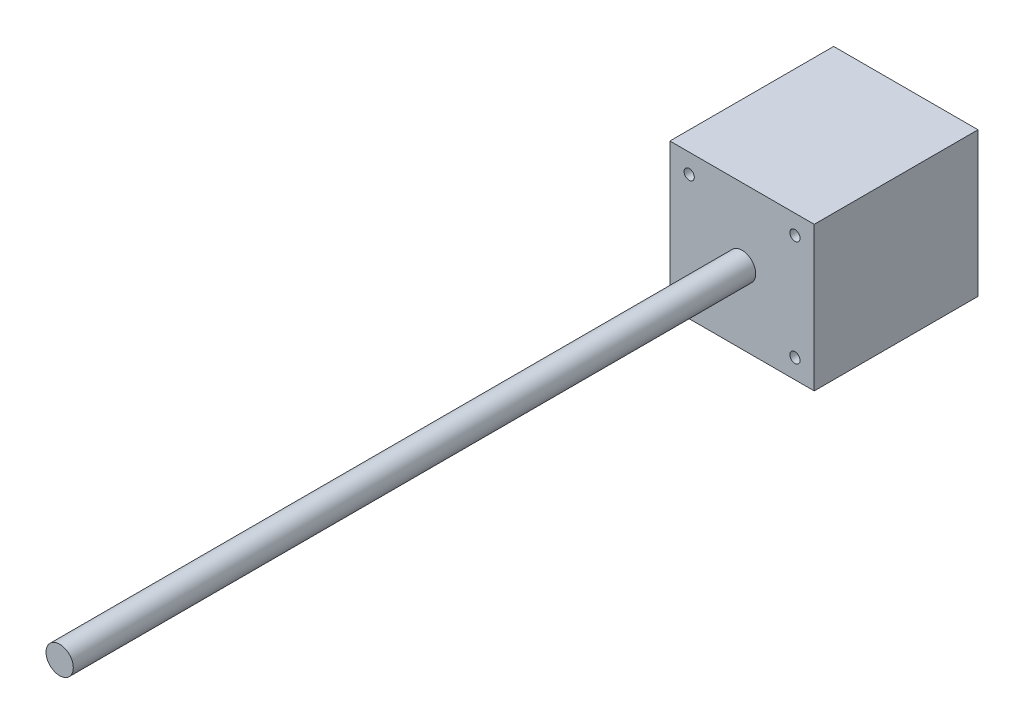
ISO-10303-21;
HEADER;
FILE_DESCRIPTION(('STEP AP214'),'2;1');
FILE_NAME('part.step','',(''),(''),'','','');
FILE_SCHEMA(('AUTOMOTIVE_DESIGN { 1 0 10303 214 1 1 1 1 }'));
ENDSEC;
DATA;
#1=APPLICATION_CONTEXT('core data for automotive mechanical design processes');
#2=APPLICATION_PROTOCOL_DEFINITION('international standard','automotive_design',2000,#1);
#3=PRODUCT_CONTEXT('',#1,'mechanical');
#4=PRODUCT('Part','Part','',(#3));
#5=PRODUCT_RELATED_PRODUCT_CATEGORY('part','',(#4));
#6=PRODUCT_DEFINITION_FORMATION('','',#4);
#7=PRODUCT_DEFINITION_CONTEXT('part definition',#1,'design');
#8=PRODUCT_DEFINITION('design','',#6,#7);
#9=PRODUCT_DEFINITION_SHAPE('','',#8);
#10=(LENGTH_UNIT() NAMED_UNIT(*) SI_UNIT(.MILLI.,.METRE.));
#11=(NAMED_UNIT(*) PLANE_ANGLE_UNIT() SI_UNIT($,.RADIAN.));
#12=(NAMED_UNIT(*) SI_UNIT($,.STERADIAN.) SOLID_ANGLE_UNIT());
#13=UNCERTAINTY_MEASURE_WITH_UNIT(LENGTH_MEASURE(1.E-05),#10,'distance_accuracy_value','');
#14=(GEOMETRIC_REPRESENTATION_CONTEXT(3) GLOBAL_UNCERTAINTY_ASSIGNED_CONTEXT((#13)) GLOBAL_UNIT_ASSIGNED_CONTEXT((#10,
#11,#12)) REPRESENTATION_CONTEXT('',''));
#15=CARTESIAN_POINT('',(0.,0.,0.));
#16=DIRECTION('',(0.,0.,1.));
#17=DIRECTION('',(1.,0.,0.));
#18=AXIS2_PLACEMENT_3D('',#15,#16,#17);
#19=CARTESIAN_POINT('',(0.,0.,48.));
#20=DIRECTION('',(0.,0.,-1.));
#21=DIRECTION('',(-1.,0.,0.));
#22=AXIS2_PLACEMENT_3D('',#19,#20,#21);
#23=PLANE('',#22);
#24=CARTESIAN_POINT('',(0.,0.,48.));
#25=DIRECTION('',(0.,0.,-1.));
#26=DIRECTION('',(-1.,0.,0.));
#27=AXIS2_PLACEMENT_3D('',#24,#25,#26);
#28=CIRCLE('',#27,4.);
#29=CARTESIAN_POINT('',(-4.,0.,48.));
#30=VERTEX_POINT('',#29);
#31=EDGE_CURVE('E11',#30,#30,#28,.F.);
#32=ORIENTED_EDGE('',*,*,#31,.F.);
#33=EDGE_LOOP('',(#32));
#34=FACE_BOUND('',#33,.T.);
#35=DIRECTION('',(0.,1.,0.));
#36=VECTOR('',#35,1.);
#37=CARTESIAN_POINT('',(21.15,-21.15,48.));
#38=LINE('',#37,#36);
#39=CARTESIAN_POINT('',(21.15,-21.15,48.));
#40=VERTEX_POINT('',#39);
#41=CARTESIAN_POINT('',(21.15,21.15,48.));
#42=VERTEX_POINT('',#41);
#43=EDGE_CURVE('E90',#40,#42,#38,.T.);
#44=ORIENTED_EDGE('',*,*,#43,.T.);
#45=DIRECTION('',(-1.,0.,0.));
#46=VECTOR('',#45,1.);
#47=CARTESIAN_POINT('',(-21.15,21.15,48.));
#48=LINE('',#47,#46);
#49=CARTESIAN_POINT('',(-21.15,21.15,48.));
#50=VERTEX_POINT('',#49);
#51=EDGE_CURVE('E85',#42,#50,#48,.T.);
#52=ORIENTED_EDGE('',*,*,#51,.T.);
#53=DIRECTION('',(0.,-1.,0.));
#54=VECTOR('',#53,1.);
#55=CARTESIAN_POINT('',(-21.15,-21.15,48.));
#56=LINE('',#55,#54);
#57=CARTESIAN_POINT('',(-21.15,-21.15,48.));
#58=VERTEX_POINT('',#57);
#59=EDGE_CURVE('E88',#50,#58,#56,.T.);
#60=ORIENTED_EDGE('',*,*,#59,.T.);
#61=DIRECTION('',(1.,0.,0.));
#62=VECTOR('',#61,1.);
#63=CARTESIAN_POINT('',(-21.15,-21.15,48.));
#64=LINE('',#63,#62);
#65=EDGE_CURVE('E54',#58,#40,#64,.T.);
#66=ORIENTED_EDGE('',*,*,#65,.T.);
#67=EDGE_LOOP('',(#44,#52,#60,#66));
#68=FACE_BOUND('',#67,.T.);
#69=CARTESIAN_POINT('',(15.5,15.5,48.));
#70=DIRECTION('',(0.,0.,1.));
#71=DIRECTION('',(1.,0.,0.));
#72=AXIS2_PLACEMENT_3D('',#69,#70,#71);
#73=CIRCLE('',#72,1.5);
#74=CARTESIAN_POINT('',(17.,15.5,48.));
#75=VERTEX_POINT('',#74);
#76=EDGE_CURVE('E107',#75,#75,#73,.T.);
#77=ORIENTED_EDGE('',*,*,#76,.F.);
#78=EDGE_LOOP('',(#77));
#79=FACE_BOUND('',#78,.T.);
#80=CARTESIAN_POINT('',(-15.5,15.5,48.));
#81=DIRECTION('',(0.,0.,1.));
#82=DIRECTION('',(1.,0.,0.));
#83=AXIS2_PLACEMENT_3D('',#80,#81,#82);
#84=CIRCLE('',#83,1.5);
#85=CARTESIAN_POINT('',(-14.,15.5,48.));
#86=VERTEX_POINT('',#85);
#87=EDGE_CURVE('E142',#86,#86,#84,.T.);
#88=ORIENTED_EDGE('',*,*,#87,.F.);
#89=EDGE_LOOP('',(#88));
#90=FACE_BOUND('',#89,.T.);
#91=CARTESIAN_POINT('',(-15.5,-15.5,48.));
#92=DIRECTION('',(0.,0.,1.));
#93=DIRECTION('',(1.,0.,0.));
#94=AXIS2_PLACEMENT_3D('',#91,#92,#93);
#95=CIRCLE('',#94,1.5);
#96=CARTESIAN_POINT('',(-14.,-15.5,48.));
#97=VERTEX_POINT('',#96);
#98=EDGE_CURVE('E137',#97,#97,#95,.T.);
#99=ORIENTED_EDGE('',*,*,#98,.F.);
#100=EDGE_LOOP('',(#99));
#101=FACE_BOUND('',#100,.T.);
#102=CARTESIAN_POINT('',(15.5,-15.5,48.));
#103=DIRECTION('',(0.,0.,1.));
#104=DIRECTION('',(1.,0.,0.));
#105=AXIS2_PLACEMENT_3D('',#102,#103,#104);
#106=CIRCLE('',#105,1.5);
#107=CARTESIAN_POINT('',(17.,-15.5,48.));
#108=VERTEX_POINT('',#107);
#109=EDGE_CURVE('E128',#108,#108,#106,.T.);
#110=ORIENTED_EDGE('',*,*,#109,.F.);
#111=EDGE_LOOP('',(#110));
#112=FACE_BOUND('',#111,.T.);
#113=ADVANCED_FACE('F37',(#34,#68,#79,#90,#101,#112),#23,.F.);
#114=CARTESIAN_POINT('',(0.,0.,0.));
#115=DIRECTION('',(0.,0.,-1.));
#116=DIRECTION('',(-1.,0.,0.));
#117=AXIS2_PLACEMENT_3D('',#114,#115,#116);
#118=PLANE('',#117);
#119=CARTESIAN_POINT('',(-15.5,-15.5,0.));
#120=DIRECTION('',(0.,0.,1.));
#121=DIRECTION('',(1.,0.,0.));
#122=AXIS2_PLACEMENT_3D('',#119,#120,#121);
#123=CIRCLE('',#122,1.5);
#124=CARTESIAN_POINT('',(-14.,-15.5,0.));
#125=VERTEX_POINT('',#124);
#126=EDGE_CURVE('E132',#125,#125,#123,.T.);
#127=ORIENTED_EDGE('',*,*,#126,.T.);
#128=EDGE_LOOP('',(#127));
#129=FACE_BOUND('',#128,.T.);
#130=CARTESIAN_POINT('',(15.5,15.5,0.));
#131=DIRECTION('',(0.,0.,1.));
#132=DIRECTION('',(1.,0.,0.));
#133=AXIS2_PLACEMENT_3D('',#130,#131,#132);
#134=CIRCLE('',#133,1.5);
#135=CARTESIAN_POINT('',(17.,15.5,0.));
#136=VERTEX_POINT('',#135);
#137=EDGE_CURVE('E145',#136,#136,#134,.T.);
#138=ORIENTED_EDGE('',*,*,#137,.T.);
#139=EDGE_LOOP('',(#138));
#140=FACE_BOUND('',#139,.T.);
#141=DIRECTION('',(0.,1.,0.));
#142=VECTOR('',#141,1.);
#143=CARTESIAN_POINT('',(21.15,-21.15,0.));
#144=LINE('',#143,#142);
#145=CARTESIAN_POINT('',(21.15,-21.15,0.));
#146=VERTEX_POINT('',#145);
#147=CARTESIAN_POINT('',(21.15,21.15,0.));
#148=VERTEX_POINT('',#147);
#149=EDGE_CURVE('E104',#146,#148,#144,.T.);
#150=ORIENTED_EDGE('',*,*,#149,.F.);
#151=DIRECTION('',(1.,0.,0.));
#152=VECTOR('',#151,1.);
#153=CARTESIAN_POINT('',(-21.15,-21.15,0.));
#154=LINE('',#153,#152);
#155=CARTESIAN_POINT('',(-21.15,-21.15,0.));
#156=VERTEX_POINT('',#155);
#157=EDGE_CURVE('E77',#156,#146,#154,.T.);
#158=ORIENTED_EDGE('',*,*,#157,.F.);
#159=DIRECTION('',(0.,-1.,0.));
#160=VECTOR('',#159,1.);
#161=CARTESIAN_POINT('',(-21.15,-21.15,0.));
#162=LINE('',#161,#160);
#163=CARTESIAN_POINT('',(-21.15,21.15,0.));
#164=VERTEX_POINT('',#163);
#165=EDGE_CURVE('E71',#164,#156,#162,.T.);
#166=ORIENTED_EDGE('',*,*,#165,.F.);
#167=DIRECTION('',(-1.,0.,0.));
#168=VECTOR('',#167,1.);
#169=CARTESIAN_POINT('',(-21.15,21.15,0.));
#170=LINE('',#169,#168);
#171=EDGE_CURVE('E95',#148,#164,#170,.T.);
#172=ORIENTED_EDGE('',*,*,#171,.F.);
#173=EDGE_LOOP('',(#150,#158,#166,#172));
#174=FACE_BOUND('',#173,.T.);
#175=CARTESIAN_POINT('',(-15.5,15.5,0.));
#176=DIRECTION('',(0.,0.,1.));
#177=DIRECTION('',(1.,0.,0.));
#178=AXIS2_PLACEMENT_3D('',#175,#176,#177);
#179=CIRCLE('',#178,1.5);
#180=CARTESIAN_POINT('',(-14.,15.5,0.));
#181=VERTEX_POINT('',#180);
#182=EDGE_CURVE('E123',#181,#181,#179,.T.);
#183=ORIENTED_EDGE('',*,*,#182,.T.);
#184=EDGE_LOOP('',(#183));
#185=FACE_BOUND('',#184,.T.);
#186=CARTESIAN_POINT('',(15.5,-15.5,0.));
#187=DIRECTION('',(0.,0.,1.));
#188=DIRECTION('',(1.,0.,0.));
#189=AXIS2_PLACEMENT_3D('',#186,#187,#188);
#190=CIRCLE('',#189,1.5);
#191=CARTESIAN_POINT('',(17.,-15.5,0.));
#192=VERTEX_POINT('',#191);
#193=EDGE_CURVE('E126',#192,#192,#190,.T.);
#194=ORIENTED_EDGE('',*,*,#193,.T.);
#195=EDGE_LOOP('',(#194));
#196=FACE_BOUND('',#195,.T.);
#197=ADVANCED_FACE('F115',(#129,#140,#174,#185,#196),#118,.T.);
#198=CARTESIAN_POINT('',(21.15,-21.15,48.));
#199=DIRECTION('',(-1.,0.,0.));
#200=DIRECTION('',(0.,0.,1.));
#201=AXIS2_PLACEMENT_3D('',#198,#199,#200);
#202=PLANE('',#201);
#203=ORIENTED_EDGE('',*,*,#149,.T.);
#204=DIRECTION('',(0.,0.,-1.));
#205=VECTOR('',#204,1.);
#206=CARTESIAN_POINT('',(21.15,21.15,48.));
#207=LINE('',#206,#205);
#208=EDGE_CURVE('E46',#42,#148,#207,.T.);
#209=ORIENTED_EDGE('',*,*,#208,.F.);
#210=ORIENTED_EDGE('',*,*,#43,.F.);
#211=DIRECTION('',(0.,0.,-1.));
#212=VECTOR('',#211,1.);
#213=CARTESIAN_POINT('',(21.15,-21.15,48.));
#214=LINE('',#213,#212);
#215=EDGE_CURVE('E100',#40,#146,#214,.T.);
#216=ORIENTED_EDGE('',*,*,#215,.T.);
#217=EDGE_LOOP('',(#203,#209,#210,#216));
#218=FACE_BOUND('',#217,.T.);
#219=ADVANCED_FACE('F39',(#218),#202,.F.);
#220=CARTESIAN_POINT('',(-21.15,21.15,48.));
#221=DIRECTION('',(0.,-1.,0.));
#222=DIRECTION('',(0.,0.,-1.));
#223=AXIS2_PLACEMENT_3D('',#220,#221,#222);
#224=PLANE('',#223);
#225=ORIENTED_EDGE('',*,*,#171,.T.);
#226=DIRECTION('',(0.,0.,-1.));
#227=VECTOR('',#226,1.);
#228=CARTESIAN_POINT('',(-21.15,21.15,48.));
#229=LINE('',#228,#227);
#230=EDGE_CURVE('E93',#50,#164,#229,.T.);
#231=ORIENTED_EDGE('',*,*,#230,.F.);
#232=ORIENTED_EDGE('',*,*,#51,.F.);
#233=ORIENTED_EDGE('',*,*,#208,.T.);
#234=EDGE_LOOP('',(#225,#231,#232,#233));
#235=FACE_BOUND('',#234,.T.);
#236=ADVANCED_FACE('F94',(#235),#224,.F.);
#237=CARTESIAN_POINT('',(-21.15,-21.15,48.));
#238=DIRECTION('',(1.,0.,0.));
#239=DIRECTION('',(0.,0.,-1.));
#240=AXIS2_PLACEMENT_3D('',#237,#238,#239);
#241=PLANE('',#240);
#242=ORIENTED_EDGE('',*,*,#165,.T.);
#243=DIRECTION('',(0.,0.,-1.));
#244=VECTOR('',#243,1.);
#245=CARTESIAN_POINT('',(-21.15,-21.15,48.));
#246=LINE('',#245,#244);
#247=EDGE_CURVE('E96',#58,#156,#246,.T.);
#248=ORIENTED_EDGE('',*,*,#247,.F.);
#249=ORIENTED_EDGE('',*,*,#59,.F.);
#250=ORIENTED_EDGE('',*,*,#230,.T.);
#251=EDGE_LOOP('',(#242,#248,#249,#250));
#252=FACE_BOUND('',#251,.T.);
#253=ADVANCED_FACE('F98',(#252),#241,.F.);
#254=CARTESIAN_POINT('',(-21.15,-21.15,48.));
#255=DIRECTION('',(0.,1.,0.));
#256=DIRECTION('',(0.,0.,1.));
#257=AXIS2_PLACEMENT_3D('',#254,#255,#256);
#258=PLANE('',#257);
#259=ORIENTED_EDGE('',*,*,#157,.T.);
#260=ORIENTED_EDGE('',*,*,#215,.F.);
#261=ORIENTED_EDGE('',*,*,#65,.F.);
#262=ORIENTED_EDGE('',*,*,#247,.T.);
#263=EDGE_LOOP('',(#259,#260,#261,#262));
#264=FACE_BOUND('',#263,.T.);
#265=ADVANCED_FACE('F156',(#264),#258,.F.);
#266=CARTESIAN_POINT('',(15.5,15.5,48.));
#267=DIRECTION('',(0.,0.,-1.));
#268=DIRECTION('',(-1.,0.,0.));
#269=AXIS2_PLACEMENT_3D('',#266,#267,#268);
#270=CYLINDRICAL_SURFACE('',#269,1.5);
#271=ORIENTED_EDGE('',*,*,#76,.T.);
#272=EDGE_LOOP('',(#271));
#273=FACE_BOUND('',#272,.T.);
#274=ORIENTED_EDGE('',*,*,#137,.F.);
#275=EDGE_LOOP('',(#274));
#276=FACE_BOUND('',#275,.T.);
#277=ADVANCED_FACE('F153',(#273,#276),#270,.F.);
#278=CARTESIAN_POINT('',(-15.5,15.5,48.));
#279=DIRECTION('',(0.,0.,-1.));
#280=DIRECTION('',(-1.,0.,0.));
#281=AXIS2_PLACEMENT_3D('',#278,#279,#280);
#282=CYLINDRICAL_SURFACE('',#281,1.5);
#283=ORIENTED_EDGE('',*,*,#87,.T.);
#284=EDGE_LOOP('',(#283));
#285=FACE_BOUND('',#284,.T.);
#286=ORIENTED_EDGE('',*,*,#182,.F.);
#287=EDGE_LOOP('',(#286));
#288=FACE_BOUND('',#287,.T.);
#289=ADVANCED_FACE('F155',(#285,#288),#282,.F.);
#290=CARTESIAN_POINT('',(-15.5,-15.5,48.));
#291=DIRECTION('',(0.,0.,-1.));
#292=DIRECTION('',(-1.,0.,0.));
#293=AXIS2_PLACEMENT_3D('',#290,#291,#292);
#294=CYLINDRICAL_SURFACE('',#293,1.5);
#295=ORIENTED_EDGE('',*,*,#98,.T.);
#296=EDGE_LOOP('',(#295));
#297=FACE_BOUND('',#296,.T.);
#298=ORIENTED_EDGE('',*,*,#126,.F.);
#299=EDGE_LOOP('',(#298));
#300=FACE_BOUND('',#299,.T.);
#301=ADVANCED_FACE('F163',(#297,#300),#294,.F.);
#302=CARTESIAN_POINT('',(15.5,-15.5,48.));
#303=DIRECTION('',(0.,0.,-1.));
#304=DIRECTION('',(-1.,0.,0.));
#305=AXIS2_PLACEMENT_3D('',#302,#303,#304);
#306=CYLINDRICAL_SURFACE('',#305,1.5);
#307=ORIENTED_EDGE('',*,*,#109,.T.);
#308=EDGE_LOOP('',(#307));
#309=FACE_BOUND('',#308,.T.);
#310=ORIENTED_EDGE('',*,*,#193,.F.);
#311=EDGE_LOOP('',(#310));
#312=FACE_BOUND('',#311,.T.);
#313=ADVANCED_FACE('F239',(#309,#312),#306,.F.);
#314=CARTESIAN_POINT('',(0.,0.,248.));
#315=DIRECTION('',(0.,0.,-1.));
#316=DIRECTION('',(-1.,0.,0.));
#317=AXIS2_PLACEMENT_3D('',#314,#315,#316);
#318=CYLINDRICAL_SURFACE('',#317,4.);
#319=CARTESIAN_POINT('',(0.,0.,248.));
#320=DIRECTION('',(0.,0.,1.));
#321=DIRECTION('',(1.,0.,0.));
#322=AXIS2_PLACEMENT_3D('',#319,#320,#321);
#323=CIRCLE('',#322,4.);
#324=CARTESIAN_POINT('',(4.,0.,248.));
#325=VERTEX_POINT('',#324);
#326=EDGE_CURVE('E129',#325,#325,#323,.T.);
#327=ORIENTED_EDGE('',*,*,#326,.F.);
#328=EDGE_LOOP('',(#327));
#329=FACE_BOUND('',#328,.T.);
#330=ORIENTED_EDGE('',*,*,#31,.T.);
#331=EDGE_LOOP('',(#330));
#332=FACE_BOUND('',#331,.T.);
#333=ADVANCED_FACE('F250',(#329,#332),#318,.T.);
#334=CARTESIAN_POINT('',(0.,0.,248.));
#335=DIRECTION('',(0.,0.,1.));
#336=DIRECTION('',(1.,0.,0.));
#337=AXIS2_PLACEMENT_3D('',#334,#335,#336);
#338=PLANE('',#337);
#339=ORIENTED_EDGE('',*,*,#326,.T.);
#340=EDGE_LOOP('',(#339));
#341=FACE_BOUND('',#340,.T.);
#342=ADVANCED_FACE('F261',(#341),#338,.T.);
#343=CLOSED_SHELL('',(#113,#197,#219,#236,#253,#265,#277,#289,#301,#313,#333,#342));
#344=MANIFOLD_SOLID_BREP('B2',#343);
#345=ADVANCED_BREP_SHAPE_REPRESENTATION('',(#18,#344),#14);
#346=SHAPE_DEFINITION_REPRESENTATION(#9,#345);
ENDSEC;
END-ISO-10303-21;
